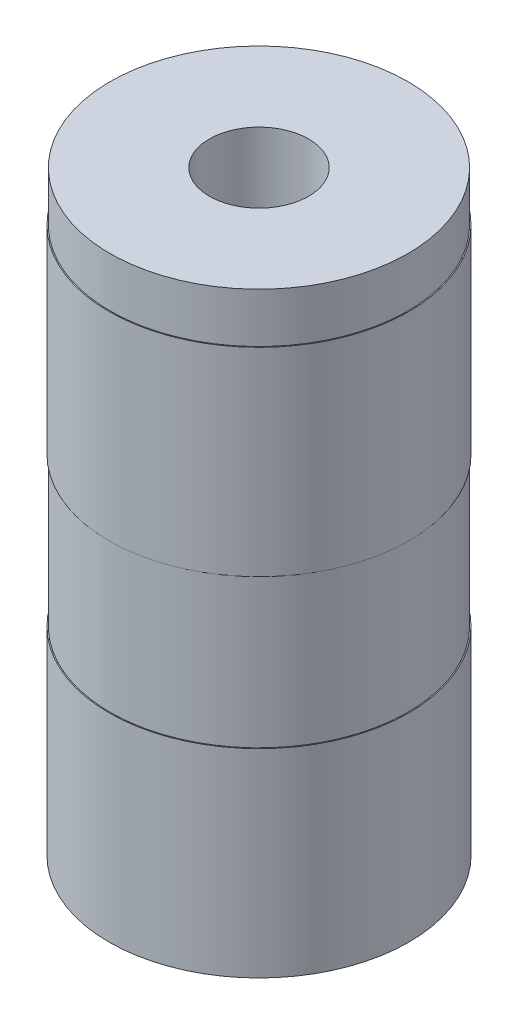
ISO-10303-21;
HEADER;
FILE_DESCRIPTION(('STEP AP214'),'2;1');
FILE_NAME('part.step','',(''),(''),'','','');
FILE_SCHEMA(('AUTOMOTIVE_DESIGN { 1 0 10303 214 1 1 1 1 }'));
ENDSEC;
DATA;
#1=APPLICATION_CONTEXT('core data for automotive mechanical design processes');
#2=APPLICATION_PROTOCOL_DEFINITION('international standard','automotive_design',2000,#1);
#3=PRODUCT_CONTEXT('',#1,'mechanical');
#4=PRODUCT('Part','Part','',(#3));
#5=PRODUCT_RELATED_PRODUCT_CATEGORY('part','',(#4));
#6=PRODUCT_DEFINITION_FORMATION('','',#4);
#7=PRODUCT_DEFINITION_CONTEXT('part definition',#1,'design');
#8=PRODUCT_DEFINITION('design','',#6,#7);
#9=PRODUCT_DEFINITION_SHAPE('','',#8);
#10=(LENGTH_UNIT() NAMED_UNIT(*) SI_UNIT(.MILLI.,.METRE.));
#11=(NAMED_UNIT(*) PLANE_ANGLE_UNIT() SI_UNIT($,.RADIAN.));
#12=(NAMED_UNIT(*) SI_UNIT($,.STERADIAN.) SOLID_ANGLE_UNIT());
#13=UNCERTAINTY_MEASURE_WITH_UNIT(LENGTH_MEASURE(1.E-05),#10,'distance_accuracy_value','');
#14=(GEOMETRIC_REPRESENTATION_CONTEXT(3) GLOBAL_UNCERTAINTY_ASSIGNED_CONTEXT((#13)) GLOBAL_UNIT_ASSIGNED_CONTEXT((#10,
#11,#12)) REPRESENTATION_CONTEXT('',''));
#15=CARTESIAN_POINT('',(0.,0.,0.));
#16=DIRECTION('',(0.,0.,1.));
#17=DIRECTION('',(1.,0.,0.));
#18=AXIS2_PLACEMENT_3D('',#15,#16,#17);
#19=CARTESIAN_POINT('',(0.,0.,0.));
#20=DIRECTION('',(0.,-1.,0.));
#21=DIRECTION('',(0.,0.,-1.));
#22=AXIS2_PLACEMENT_3D('',#19,#20,#21);
#23=PLANE('',#22);
#24=CARTESIAN_POINT('',(0.,0.,0.));
#25=DIRECTION('',(0.,-1.,0.));
#26=DIRECTION('',(0.,0.,-1.));
#27=AXIS2_PLACEMENT_3D('',#24,#25,#26);
#28=CIRCLE('',#27,15.1);
#29=CARTESIAN_POINT('',(0.,0.,-15.1));
#30=VERTEX_POINT('',#29);
#31=EDGE_CURVE('E10',#30,#30,#28,.T.);
#32=ORIENTED_EDGE('',*,*,#31,.T.);
#33=EDGE_LOOP('',(#32));
#34=FACE_BOUND('',#33,.T.);
#35=CARTESIAN_POINT('',(0.,0.,0.));
#36=DIRECTION('',(0.,-1.,0.));
#37=DIRECTION('',(0.,0.,-1.));
#38=AXIS2_PLACEMENT_3D('',#35,#36,#37);
#39=CIRCLE('',#38,5.);
#40=CARTESIAN_POINT('',(0.,0.,-5.));
#41=VERTEX_POINT('',#40);
#42=EDGE_CURVE('E84',#41,#41,#39,.T.);
#43=ORIENTED_EDGE('',*,*,#42,.F.);
#44=EDGE_LOOP('',(#43));
#45=FACE_BOUND('',#44,.T.);
#46=ADVANCED_FACE('F41',(#34,#45),#23,.T.);
#47=CARTESIAN_POINT('',(0.,0.,0.));
#48=DIRECTION('',(0.,-1.,0.));
#49=DIRECTION('',(0.,0.,-1.));
#50=AXIS2_PLACEMENT_3D('',#47,#48,#49);
#51=CYLINDRICAL_SURFACE('',#50,15.1);
#52=ORIENTED_EDGE('',*,*,#31,.F.);
#53=EDGE_LOOP('',(#52));
#54=FACE_BOUND('',#53,.T.);
#55=CARTESIAN_POINT('',(0.,20.,0.));
#56=DIRECTION('',(0.,-1.,0.));
#57=DIRECTION('',(0.,0.,-1.));
#58=AXIS2_PLACEMENT_3D('',#55,#56,#57);
#59=CIRCLE('',#58,15.1);
#60=CARTESIAN_POINT('',(0.,20.,-15.1));
#61=VERTEX_POINT('',#60);
#62=EDGE_CURVE('E48',#61,#61,#59,.T.);
#63=ORIENTED_EDGE('',*,*,#62,.T.);
#64=EDGE_LOOP('',(#63));
#65=FACE_BOUND('',#64,.T.);
#66=ADVANCED_FACE('F92',(#54,#65),#51,.T.);
#67=CARTESIAN_POINT('',(0.,20.,0.));
#68=DIRECTION('',(0.,-1.,0.));
#69=DIRECTION('',(0.,0.,-1.));
#70=AXIS2_PLACEMENT_3D('',#67,#68,#69);
#71=PLANE('',#70);
#72=ORIENTED_EDGE('',*,*,#62,.F.);
#73=EDGE_LOOP('',(#72));
#74=FACE_BOUND('',#73,.T.);
#75=CARTESIAN_POINT('',(0.,20.,0.));
#76=DIRECTION('',(0.,-1.,0.));
#77=DIRECTION('',(0.,0.,-1.));
#78=AXIS2_PLACEMENT_3D('',#75,#76,#77);
#79=CIRCLE('',#78,15.);
#80=CARTESIAN_POINT('',(0.,20.,-15.));
#81=VERTEX_POINT('',#80);
#82=EDGE_CURVE('E53',#81,#81,#79,.T.);
#83=ORIENTED_EDGE('',*,*,#82,.T.);
#84=EDGE_LOOP('',(#83));
#85=FACE_BOUND('',#84,.T.);
#86=ADVANCED_FACE('F96',(#74,#85),#71,.F.);
#87=CARTESIAN_POINT('',(0.,0.,0.));
#88=DIRECTION('',(0.,-1.,0.));
#89=DIRECTION('',(0.,0.,-1.));
#90=AXIS2_PLACEMENT_3D('',#87,#88,#89);
#91=CYLINDRICAL_SURFACE('',#90,15.);
#92=CARTESIAN_POINT('',(0.,35.,0.));
#93=DIRECTION('',(0.,-1.,0.));
#94=DIRECTION('',(0.,0.,-1.));
#95=AXIS2_PLACEMENT_3D('',#92,#93,#94);
#96=CIRCLE('',#95,15.);
#97=CARTESIAN_POINT('',(0.,35.,-15.));
#98=VERTEX_POINT('',#97);
#99=EDGE_CURVE('E58',#98,#98,#96,.T.);
#100=ORIENTED_EDGE('',*,*,#99,.T.);
#101=EDGE_LOOP('',(#100));
#102=FACE_BOUND('',#101,.T.);
#103=ORIENTED_EDGE('',*,*,#82,.F.);
#104=EDGE_LOOP('',(#103));
#105=FACE_BOUND('',#104,.T.);
#106=ADVANCED_FACE('F101',(#102,#105),#91,.T.);
#107=CARTESIAN_POINT('',(0.,35.,0.));
#108=DIRECTION('',(0.,1.,0.));
#109=DIRECTION('',(0.,0.,1.));
#110=AXIS2_PLACEMENT_3D('',#107,#108,#109);
#111=PLANE('',#110);
#112=ORIENTED_EDGE('',*,*,#99,.F.);
#113=EDGE_LOOP('',(#112));
#114=FACE_BOUND('',#113,.T.);
#115=CARTESIAN_POINT('',(0.,35.,0.));
#116=DIRECTION('',(0.,-1.,0.));
#117=DIRECTION('',(0.,0.,-1.));
#118=AXIS2_PLACEMENT_3D('',#115,#116,#117);
#119=CIRCLE('',#118,15.1);
#120=CARTESIAN_POINT('',(0.,35.,-15.1));
#121=VERTEX_POINT('',#120);
#122=EDGE_CURVE('E64',#121,#121,#119,.T.);
#123=ORIENTED_EDGE('',*,*,#122,.T.);
#124=EDGE_LOOP('',(#123));
#125=FACE_BOUND('',#124,.T.);
#126=ADVANCED_FACE('F105',(#114,#125),#111,.F.);
#127=CARTESIAN_POINT('',(0.,0.,0.));
#128=DIRECTION('',(0.,-1.,0.));
#129=DIRECTION('',(0.,0.,-1.));
#130=AXIS2_PLACEMENT_3D('',#127,#128,#129);
#131=CYLINDRICAL_SURFACE('',#130,15.1);
#132=ORIENTED_EDGE('',*,*,#122,.F.);
#133=EDGE_LOOP('',(#132));
#134=FACE_BOUND('',#133,.T.);
#135=CARTESIAN_POINT('',(0.,55.,0.));
#136=DIRECTION('',(0.,-1.,0.));
#137=DIRECTION('',(0.,0.,-1.));
#138=AXIS2_PLACEMENT_3D('',#135,#136,#137);
#139=CIRCLE('',#138,15.1);
#140=CARTESIAN_POINT('',(0.,55.,-15.1));
#141=VERTEX_POINT('',#140);
#142=EDGE_CURVE('E68',#141,#141,#139,.T.);
#143=ORIENTED_EDGE('',*,*,#142,.T.);
#144=EDGE_LOOP('',(#143));
#145=FACE_BOUND('',#144,.T.);
#146=ADVANCED_FACE('F108',(#134,#145),#131,.T.);
#147=CARTESIAN_POINT('',(0.,55.,0.));
#148=DIRECTION('',(0.,1.,0.));
#149=DIRECTION('',(0.,0.,1.));
#150=AXIS2_PLACEMENT_3D('',#147,#148,#149);
#151=PLANE('',#150);
#152=CARTESIAN_POINT('',(0.,55.,0.));
#153=DIRECTION('',(0.,-1.,0.));
#154=DIRECTION('',(0.,0.,-1.));
#155=AXIS2_PLACEMENT_3D('',#152,#153,#154);
#156=CIRCLE('',#155,15.);
#157=CARTESIAN_POINT('',(0.,55.,-15.));
#158=VERTEX_POINT('',#157);
#159=EDGE_CURVE('E72',#158,#158,#156,.T.);
#160=ORIENTED_EDGE('',*,*,#159,.T.);
#161=EDGE_LOOP('',(#160));
#162=FACE_BOUND('',#161,.T.);
#163=ORIENTED_EDGE('',*,*,#142,.F.);
#164=EDGE_LOOP('',(#163));
#165=FACE_BOUND('',#164,.T.);
#166=ADVANCED_FACE('F112',(#162,#165),#151,.T.);
#167=CARTESIAN_POINT('',(0.,60.,0.));
#168=DIRECTION('',(0.,-1.,0.));
#169=DIRECTION('',(0.,0.,-1.));
#170=AXIS2_PLACEMENT_3D('',#167,#168,#169);
#171=CIRCLE('',#170,15.);
#172=CARTESIAN_POINT('',(0.,60.,-15.));
#173=VERTEX_POINT('',#172);
#174=EDGE_CURVE('E76',#173,#173,#171,.T.);
#175=ORIENTED_EDGE('',*,*,#174,.T.);
#176=EDGE_LOOP('',(#175));
#177=FACE_BOUND('',#176,.T.);
#178=ORIENTED_EDGE('',*,*,#159,.F.);
#179=EDGE_LOOP('',(#178));
#180=FACE_BOUND('',#179,.T.);
#181=ADVANCED_FACE('F116',(#177,#180),#91,.T.);
#182=CARTESIAN_POINT('',(0.,60.,0.));
#183=DIRECTION('',(0.,-1.,0.));
#184=DIRECTION('',(0.,0.,-1.));
#185=AXIS2_PLACEMENT_3D('',#182,#183,#184);
#186=PLANE('',#185);
#187=ORIENTED_EDGE('',*,*,#174,.F.);
#188=EDGE_LOOP('',(#187));
#189=FACE_BOUND('',#188,.T.);
#190=CARTESIAN_POINT('',(0.,60.,0.));
#191=DIRECTION('',(0.,-1.,0.));
#192=DIRECTION('',(0.,0.,-1.));
#193=AXIS2_PLACEMENT_3D('',#190,#191,#192);
#194=CIRCLE('',#193,5.);
#195=CARTESIAN_POINT('',(0.,60.,-5.));
#196=VERTEX_POINT('',#195);
#197=EDGE_CURVE('E80',#196,#196,#194,.T.);
#198=ORIENTED_EDGE('',*,*,#197,.T.);
#199=EDGE_LOOP('',(#198));
#200=FACE_BOUND('',#199,.T.);
#201=ADVANCED_FACE('F120',(#189,#200),#186,.F.);
#202=CARTESIAN_POINT('',(0.,0.,0.));
#203=DIRECTION('',(0.,-1.,0.));
#204=DIRECTION('',(0.,0.,-1.));
#205=AXIS2_PLACEMENT_3D('',#202,#203,#204);
#206=CYLINDRICAL_SURFACE('',#205,5.);
#207=ORIENTED_EDGE('',*,*,#197,.F.);
#208=EDGE_LOOP('',(#207));
#209=FACE_BOUND('',#208,.T.);
#210=ORIENTED_EDGE('',*,*,#42,.T.);
#211=EDGE_LOOP('',(#210));
#212=FACE_BOUND('',#211,.T.);
#213=ADVANCED_FACE('F89',(#209,#212),#206,.F.);
#214=CLOSED_SHELL('',(#46,#66,#86,#106,#126,#146,#166,#181,#201,#213));
#215=MANIFOLD_SOLID_BREP('B2',#214);
#216=ADVANCED_BREP_SHAPE_REPRESENTATION('',(#18,#215),#14);
#217=SHAPE_DEFINITION_REPRESENTATION(#9,#216);
ENDSEC;
END-ISO-10303-21;
